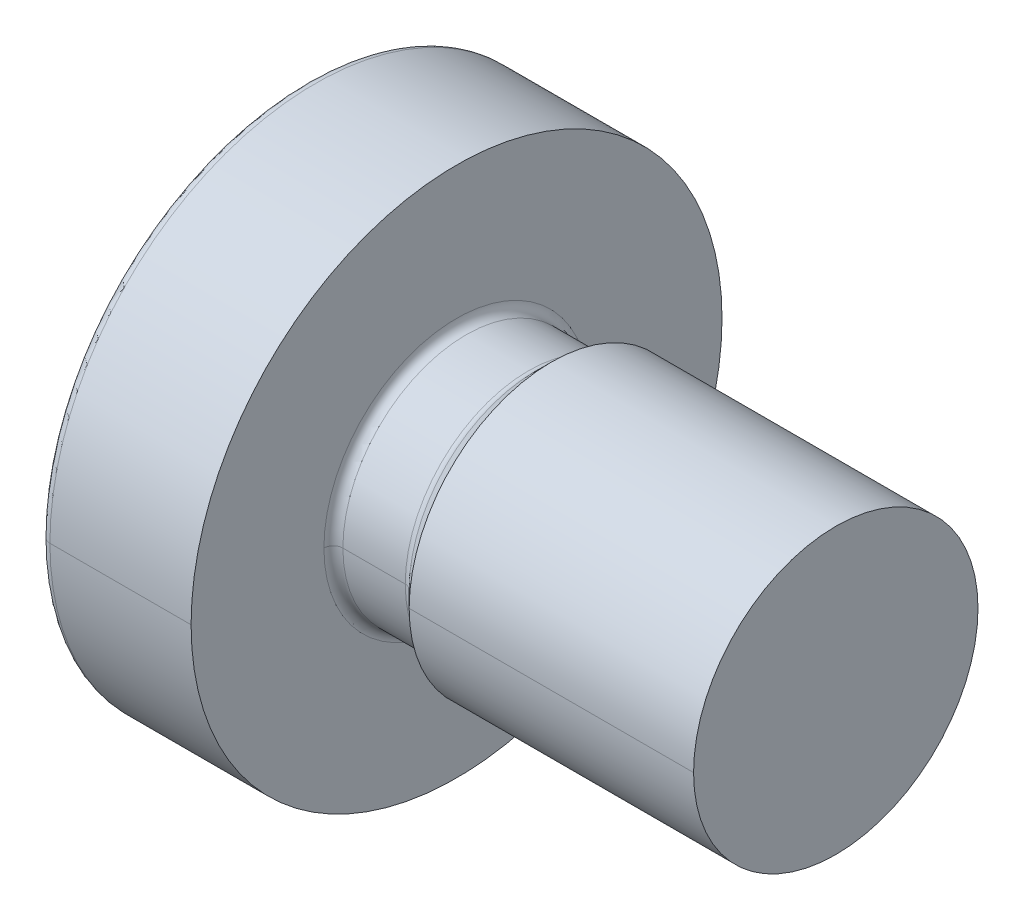
ISO-10303-21;
HEADER;
FILE_DESCRIPTION(('STEP AP214'),'2;1');
FILE_NAME('part.step','',(''),(''),'','','');
FILE_SCHEMA(('AUTOMOTIVE_DESIGN { 1 0 10303 214 1 1 1 1 }'));
ENDSEC;
DATA;
#1=APPLICATION_CONTEXT('core data for automotive mechanical design processes');
#2=APPLICATION_PROTOCOL_DEFINITION('international standard','automotive_design',2000,#1);
#3=PRODUCT_CONTEXT('',#1,'mechanical');
#4=PRODUCT('Part','Part','',(#3));
#5=PRODUCT_RELATED_PRODUCT_CATEGORY('part','',(#4));
#6=PRODUCT_DEFINITION_FORMATION('','',#4);
#7=PRODUCT_DEFINITION_CONTEXT('part definition',#1,'design');
#8=PRODUCT_DEFINITION('design','',#6,#7);
#9=PRODUCT_DEFINITION_SHAPE('','',#8);
#10=(LENGTH_UNIT() NAMED_UNIT(*) SI_UNIT(.MILLI.,.METRE.));
#11=(NAMED_UNIT(*) PLANE_ANGLE_UNIT() SI_UNIT($,.RADIAN.));
#12=(NAMED_UNIT(*) SI_UNIT($,.STERADIAN.) SOLID_ANGLE_UNIT());
#13=UNCERTAINTY_MEASURE_WITH_UNIT(LENGTH_MEASURE(1.E-05),#10,'distance_accuracy_value','');
#14=(GEOMETRIC_REPRESENTATION_CONTEXT(3) GLOBAL_UNCERTAINTY_ASSIGNED_CONTEXT((#13)) GLOBAL_UNIT_ASSIGNED_CONTEXT((#10,
#11,#12)) REPRESENTATION_CONTEXT('',''));
#15=CARTESIAN_POINT('',(0.,0.,0.));
#16=DIRECTION('',(0.,0.,1.));
#17=DIRECTION('',(1.,0.,0.));
#18=AXIS2_PLACEMENT_3D('',#15,#16,#17);
#19=CARTESIAN_POINT('',(2.5,0.,0.));
#20=DIRECTION('',(-1.,0.,0.));
#21=DIRECTION('',(0.,0.,1.));
#22=AXIS2_PLACEMENT_3D('',#19,#20,#21);
#23=TOROIDAL_SURFACE('',#22,1.399,0.1);
#24=CARTESIAN_POINT('',(2.4,0.,0.));
#25=DIRECTION('',(-1.,0.,0.));
#26=DIRECTION('',(0.,0.,1.));
#27=AXIS2_PLACEMENT_3D('',#24,#25,#26);
#28=CIRCLE('',#27,1.399);
#29=CARTESIAN_POINT('',(2.4,0.,-1.399));
#30=VERTEX_POINT('',#29);
#31=CARTESIAN_POINT('',(2.4,0.,1.399));
#32=VERTEX_POINT('',#31);
#33=EDGE_CURVE('E40',#30,#32,#28,.T.);
#34=ORIENTED_EDGE('',*,*,#33,.F.);
#35=CARTESIAN_POINT('',(2.5,0.,-1.399));
#36=DIRECTION('',(0.,1.,0.));
#37=DIRECTION('',(0.,0.,1.));
#38=AXIS2_PLACEMENT_3D('',#35,#36,#37);
#39=CIRCLE('',#38,0.1);
#40=CARTESIAN_POINT('',(2.5,0.,-1.299));
#41=VERTEX_POINT('',#40);
#42=EDGE_CURVE('E10',#30,#41,#39,.T.);
#43=ORIENTED_EDGE('',*,*,#42,.T.);
#44=CARTESIAN_POINT('',(2.5,0.,0.));
#45=DIRECTION('',(1.,0.,0.));
#46=DIRECTION('',(0.,0.,1.));
#47=AXIS2_PLACEMENT_3D('',#44,#45,#46);
#48=CIRCLE('',#47,1.299);
#49=CARTESIAN_POINT('',(2.5,0.,1.299));
#50=VERTEX_POINT('',#49);
#51=EDGE_CURVE('E291',#50,#41,#48,.T.);
#52=ORIENTED_EDGE('',*,*,#51,.F.);
#53=CARTESIAN_POINT('',(2.5,0.,1.399));
#54=DIRECTION('',(0.,-1.,0.));
#55=DIRECTION('',(0.,0.,-1.));
#56=AXIS2_PLACEMENT_3D('',#53,#54,#55);
#57=CIRCLE('',#56,0.1);
#58=EDGE_CURVE('E267',#32,#50,#57,.T.);
#59=ORIENTED_EDGE('',*,*,#58,.F.);
#60=EDGE_LOOP('',(#34,#43,#52,#59));
#61=FACE_BOUND('',#60,.T.);
#62=ADVANCED_FACE('F15',(#61),#23,.F.);
#63=CARTESIAN_POINT('',(3.15757864376269,0.,0.));
#64=DIRECTION('',(-1.,0.,0.));
#65=DIRECTION('',(0.,0.,1.));
#66=AXIS2_PLACEMENT_3D('',#63,#64,#65);
#67=TOROIDAL_SURFACE('',#66,1.399,0.1);
#68=CARTESIAN_POINT('',(3.15757864376269,0.,0.));
#69=DIRECTION('',(-1.,0.,0.));
#70=DIRECTION('',(0.,0.,1.));
#71=AXIS2_PLACEMENT_3D('',#68,#69,#70);
#72=CIRCLE('',#71,1.299);
#73=CARTESIAN_POINT('',(3.15757864376269,0.,-1.299));
#74=VERTEX_POINT('',#73);
#75=CARTESIAN_POINT('',(3.15757864376269,0.,1.299));
#76=VERTEX_POINT('',#75);
#77=EDGE_CURVE('E259',#74,#76,#72,.T.);
#78=ORIENTED_EDGE('',*,*,#77,.F.);
#79=CARTESIAN_POINT('',(3.15757864376269,0.,-1.399));
#80=DIRECTION('',(0.,1.,0.));
#81=DIRECTION('',(0.,0.,1.));
#82=AXIS2_PLACEMENT_3D('',#79,#80,#81);
#83=CIRCLE('',#82,0.1);
#84=CARTESIAN_POINT('',(3.22828932188134,0.,-1.32828932188134));
#85=VERTEX_POINT('',#84);
#86=EDGE_CURVE('E26',#74,#85,#83,.T.);
#87=ORIENTED_EDGE('',*,*,#86,.T.);
#88=CARTESIAN_POINT('',(3.22828932188134,0.,0.));
#89=DIRECTION('',(1.,0.,0.));
#90=DIRECTION('',(0.,0.,-1.));
#91=AXIS2_PLACEMENT_3D('',#88,#89,#90);
#92=CIRCLE('',#91,1.32828932188134);
#93=CARTESIAN_POINT('',(3.22828932188134,0.,1.32828932188134));
#94=VERTEX_POINT('',#93);
#95=EDGE_CURVE('E261',#94,#85,#92,.T.);
#96=ORIENTED_EDGE('',*,*,#95,.F.);
#97=CARTESIAN_POINT('',(3.15757864376269,0.,1.399));
#98=DIRECTION('',(0.,-1.,0.));
#99=DIRECTION('',(0.,0.,-1.));
#100=AXIS2_PLACEMENT_3D('',#97,#98,#99);
#101=CIRCLE('',#100,0.1);
#102=EDGE_CURVE('E255',#76,#94,#101,.T.);
#103=ORIENTED_EDGE('',*,*,#102,.F.);
#104=EDGE_LOOP('',(#78,#87,#96,#103));
#105=FACE_BOUND('',#104,.T.);
#106=ADVANCED_FACE('F257',(#105),#67,.F.);
#107=CARTESIAN_POINT('',(0.910990339947826,0.,0.));
#108=DIRECTION('',(1.,0.,0.));
#109=DIRECTION('',(0.,0.,-1.));
#110=AXIS2_PLACEMENT_3D('',#107,#108,#109);
#111=TOROIDAL_SURFACE('',#110,2.7,0.1);
#112=CARTESIAN_POINT('',(0.827541163212067,0.,0.));
#113=DIRECTION('',(-1.,0.,0.));
#114=DIRECTION('',(0.,0.,-1.));
#115=AXIS2_PLACEMENT_3D('',#112,#113,#114);
#116=CIRCLE('',#115,2.75510204081632);
#117=CARTESIAN_POINT('',(0.827541163212067,0.,2.75510204081632));
#118=VERTEX_POINT('',#117);
#119=CARTESIAN_POINT('',(0.827541163212066,2.75510204081632,0.));
#120=VERTEX_POINT('',#119);
#121=EDGE_CURVE('E203',#118,#120,#116,.T.);
#122=ORIENTED_EDGE('',*,*,#121,.F.);
#123=CARTESIAN_POINT('',(0.910990339947826,0.,2.7));
#124=DIRECTION('',(0.,1.,0.));
#125=DIRECTION('',(0.,0.,1.));
#126=AXIS2_PLACEMENT_3D('',#123,#124,#125);
#127=CIRCLE('',#126,0.1);
#128=CARTESIAN_POINT('',(0.910990339947826,0.,2.8));
#129=VERTEX_POINT('',#128);
#130=EDGE_CURVE('E363',#118,#129,#127,.T.);
#131=ORIENTED_EDGE('',*,*,#130,.T.);
#132=CARTESIAN_POINT('',(0.910990339947826,0.,0.));
#133=DIRECTION('',(1.,0.,0.));
#134=DIRECTION('',(0.,0.,-1.));
#135=AXIS2_PLACEMENT_3D('',#132,#133,#134);
#136=CIRCLE('',#135,2.8);
#137=CARTESIAN_POINT('',(0.910990339947826,0.,-2.8));
#138=VERTEX_POINT('',#137);
#139=EDGE_CURVE('E376',#138,#129,#136,.T.);
#140=ORIENTED_EDGE('',*,*,#139,.F.);
#141=CARTESIAN_POINT('',(0.910990339947826,0.,-2.7));
#142=DIRECTION('',(0.,-1.,0.));
#143=DIRECTION('',(0.,0.,-1.));
#144=AXIS2_PLACEMENT_3D('',#141,#142,#143);
#145=CIRCLE('',#144,0.1);
#146=CARTESIAN_POINT('',(0.827541163212067,0.,-2.75510204081632));
#147=VERTEX_POINT('',#146);
#148=EDGE_CURVE('E214',#147,#138,#145,.T.);
#149=ORIENTED_EDGE('',*,*,#148,.F.);
#150=CARTESIAN_POINT('',(0.827541163212067,0.,0.));
#151=DIRECTION('',(-1.,0.,0.));
#152=DIRECTION('',(0.,0.,-1.));
#153=AXIS2_PLACEMENT_3D('',#150,#151,#152);
#154=CIRCLE('',#153,2.75510204081632);
#155=EDGE_CURVE('E498',#120,#147,#154,.T.);
#156=ORIENTED_EDGE('',*,*,#155,.F.);
#157=EDGE_LOOP('',(#122,#131,#140,#149,#156));
#158=FACE_BOUND('',#157,.T.);
#159=ADVANCED_FACE('F656',(#158),#111,.T.);
#160=CARTESIAN_POINT('',(-3.4420013783492,0.,0.));
#161=DIRECTION('',(-1.,0.,0.));
#162=DIRECTION('',(0.,0.,1.));
#163=AXIS2_PLACEMENT_3D('',#160,#161,#162);
#164=CYLINDRICAL_SURFACE('',#163,1.5);
#165=CARTESIAN_POINT('',(6.4,0.,0.));
#166=DIRECTION('',(-1.,0.,0.));
#167=DIRECTION('',(0.,0.,1.));
#168=AXIS2_PLACEMENT_3D('',#165,#166,#167);
#169=CIRCLE('',#168,1.5);
#170=CARTESIAN_POINT('',(6.4,0.,1.5));
#171=VERTEX_POINT('',#170);
#172=CARTESIAN_POINT('',(6.4,0.,-1.5));
#173=VERTEX_POINT('',#172);
#174=EDGE_CURVE('E370',#171,#173,#169,.T.);
#175=ORIENTED_EDGE('',*,*,#174,.T.);
#176=DIRECTION('',(-1.,0.,0.));
#177=VECTOR('',#176,1.);
#178=CARTESIAN_POINT('',(-3.4420013783492,0.,-1.5));
#179=LINE('',#178,#177);
#180=CARTESIAN_POINT('',(3.4,0.,-1.5));
#181=VERTEX_POINT('',#180);
#182=EDGE_CURVE('E407',#173,#181,#179,.T.);
#183=ORIENTED_EDGE('',*,*,#182,.T.);
#184=CARTESIAN_POINT('',(3.4,0.,0.));
#185=DIRECTION('',(-1.,0.,0.));
#186=DIRECTION('',(0.,0.,1.));
#187=AXIS2_PLACEMENT_3D('',#184,#185,#186);
#188=CIRCLE('',#187,1.5);
#189=CARTESIAN_POINT('',(3.4,0.,1.5));
#190=VERTEX_POINT('',#189);
#191=EDGE_CURVE('E284',#190,#181,#188,.T.);
#192=ORIENTED_EDGE('',*,*,#191,.F.);
#193=DIRECTION('',(-1.,0.,0.));
#194=VECTOR('',#193,1.);
#195=CARTESIAN_POINT('',(-3.4420013783492,0.,1.5));
#196=LINE('',#195,#194);
#197=EDGE_CURVE('E419',#171,#190,#196,.T.);
#198=ORIENTED_EDGE('',*,*,#197,.F.);
#199=EDGE_LOOP('',(#175,#183,#192,#198));
#200=FACE_BOUND('',#199,.T.);
#201=ADVANCED_FACE('F631',(#200),#164,.T.);
#202=CARTESIAN_POINT('',(3.4,0.,0.));
#203=DIRECTION('',(1.,0.,0.));
#204=DIRECTION('',(0.,0.,-1.));
#205=AXIS2_PLACEMENT_3D('',#202,#203,#204);
#206=CONICAL_SURFACE('',#205,1.5,0.78539816339744);
#207=CARTESIAN_POINT('',(3.22828932188134,0.,0.));
#208=DIRECTION('',(1.,0.,0.));
#209=DIRECTION('',(0.,0.,-1.));
#210=AXIS2_PLACEMENT_3D('',#207,#208,#209);
#211=CIRCLE('',#210,1.32828932188134);
#212=EDGE_CURVE('E334',#85,#94,#211,.T.);
#213=ORIENTED_EDGE('',*,*,#212,.T.);
#214=DIRECTION('',(0.707106781186554,0.,0.707106781186541));
#215=VECTOR('',#214,1.);
#216=CARTESIAN_POINT('',(3.4,0.,1.5));
#217=LINE('',#216,#215);
#218=EDGE_CURVE('E330',#94,#190,#217,.T.);
#219=ORIENTED_EDGE('',*,*,#218,.T.);
#220=ORIENTED_EDGE('',*,*,#191,.T.);
#221=DIRECTION('',(0.707106781186554,0.,-0.707106781186541));
#222=VECTOR('',#221,1.);
#223=CARTESIAN_POINT('',(3.4,0.,-1.5));
#224=LINE('',#223,#222);
#225=EDGE_CURVE('E321',#85,#181,#224,.T.);
#226=ORIENTED_EDGE('',*,*,#225,.F.);
#227=EDGE_LOOP('',(#213,#219,#220,#226));
#228=FACE_BOUND('',#227,.T.);
#229=ADVANCED_FACE('F627',(#228),#206,.T.);
#230=CARTESIAN_POINT('',(-3.4420013783492,0.,0.));
#231=DIRECTION('',(-1.,0.,0.));
#232=DIRECTION('',(0.,0.,1.));
#233=AXIS2_PLACEMENT_3D('',#230,#231,#232);
#234=CYLINDRICAL_SURFACE('',#233,1.299);
#235=CARTESIAN_POINT('',(3.15757864376269,0.,0.));
#236=DIRECTION('',(-1.,0.,0.));
#237=DIRECTION('',(0.,0.,1.));
#238=AXIS2_PLACEMENT_3D('',#235,#236,#237);
#239=CIRCLE('',#238,1.299);
#240=EDGE_CURVE('E280',#76,#74,#239,.T.);
#241=ORIENTED_EDGE('',*,*,#240,.T.);
#242=DIRECTION('',(-1.,0.,0.));
#243=VECTOR('',#242,1.);
#244=CARTESIAN_POINT('',(-3.4420013783492,0.,-1.299));
#245=LINE('',#244,#243);
#246=EDGE_CURVE('E276',#74,#41,#245,.T.);
#247=ORIENTED_EDGE('',*,*,#246,.T.);
#248=CARTESIAN_POINT('',(2.5,0.,0.));
#249=DIRECTION('',(1.,0.,0.));
#250=DIRECTION('',(0.,0.,1.));
#251=AXIS2_PLACEMENT_3D('',#248,#249,#250);
#252=CIRCLE('',#251,1.299);
#253=EDGE_CURVE('E289',#41,#50,#252,.T.);
#254=ORIENTED_EDGE('',*,*,#253,.T.);
#255=DIRECTION('',(-1.,0.,0.));
#256=VECTOR('',#255,1.);
#257=CARTESIAN_POINT('',(-3.4420013783492,0.,1.299));
#258=LINE('',#257,#256);
#259=EDGE_CURVE('E274',#76,#50,#258,.T.);
#260=ORIENTED_EDGE('',*,*,#259,.F.);
#261=EDGE_LOOP('',(#241,#247,#254,#260));
#262=FACE_BOUND('',#261,.T.);
#263=ADVANCED_FACE('F287',(#262),#234,.T.);
#264=CARTESIAN_POINT('',(-3.4420013783492,0.,0.));
#265=DIRECTION('',(-1.,0.,0.));
#266=DIRECTION('',(0.,0.,1.));
#267=AXIS2_PLACEMENT_3D('',#264,#265,#266);
#268=CYLINDRICAL_SURFACE('',#267,2.8);
#269=CARTESIAN_POINT('',(2.4,0.,0.));
#270=DIRECTION('',(-1.,0.,0.));
#271=DIRECTION('',(0.,0.,1.));
#272=AXIS2_PLACEMENT_3D('',#269,#270,#271);
#273=CIRCLE('',#272,2.8);
#274=CARTESIAN_POINT('',(2.4,0.,2.8));
#275=VERTEX_POINT('',#274);
#276=CARTESIAN_POINT('',(2.4,0.,-2.8));
#277=VERTEX_POINT('',#276);
#278=EDGE_CURVE('E375',#275,#277,#273,.T.);
#279=ORIENTED_EDGE('',*,*,#278,.T.);
#280=DIRECTION('',(-1.,0.,0.));
#281=VECTOR('',#280,1.);
#282=CARTESIAN_POINT('',(-3.4420013783492,0.,-2.8));
#283=LINE('',#282,#281);
#284=EDGE_CURVE('E371',#277,#138,#283,.T.);
#285=ORIENTED_EDGE('',*,*,#284,.T.);
#286=ORIENTED_EDGE('',*,*,#139,.T.);
#287=DIRECTION('',(-1.,0.,0.));
#288=VECTOR('',#287,1.);
#289=CARTESIAN_POINT('',(-3.4420013783492,0.,2.8));
#290=LINE('',#289,#288);
#291=EDGE_CURVE('E390',#275,#129,#290,.T.);
#292=ORIENTED_EDGE('',*,*,#291,.F.);
#293=EDGE_LOOP('',(#279,#285,#286,#292));
#294=FACE_BOUND('',#293,.T.);
#295=ADVANCED_FACE('F674',(#294),#268,.T.);
#296=CARTESIAN_POINT('',(5.,0.,0.));
#297=DIRECTION('',(0.,0.,-1.));
#298=DIRECTION('',(0.,1.,0.));
#299=AXIS2_PLACEMENT_3D('',#296,#297,#298);
#300=SPHERICAL_SURFACE('',#299,5.);
#301=ORIENTED_EDGE('',*,*,#155,.T.);
#302=CARTESIAN_POINT('',(0.827541163212067,0.,0.));
#303=DIRECTION('',(-1.,0.,0.));
#304=DIRECTION('',(0.,0.,-1.));
#305=AXIS2_PLACEMENT_3D('',#302,#303,#304);
#306=CIRCLE('',#305,2.75510204081632);
#307=CARTESIAN_POINT('',(0.827541163212066,-2.75510204081632,0.));
#308=VERTEX_POINT('',#307);
#309=EDGE_CURVE('E315',#147,#308,#306,.T.);
#310=ORIENTED_EDGE('',*,*,#309,.T.);
#311=CARTESIAN_POINT('',(5.,0.,0.));
#312=DIRECTION('',(0.,0.,-1.));
#313=DIRECTION('',(0.,1.,0.));
#314=AXIS2_PLACEMENT_3D('',#311,#312,#313);
#315=CIRCLE('',#314,5.);
#316=CARTESIAN_POINT('',(0.0483882559325496,-0.693931650822548,0.));
#317=VERTEX_POINT('',#316);
#318=EDGE_CURVE('E311',#308,#317,#315,.T.);
#319=ORIENTED_EDGE('',*,*,#318,.T.);
#320=CARTESIAN_POINT('',(5.00907871968526,-0.073940238239228,0.0283829982019893));
#321=DIRECTION('',(0.113883497498907,-0.927506656060475,0.356036447517571));
#322=DIRECTION('',(0.,-0.358367949545293,-0.933580426497205));
#323=AXIS2_PLACEMENT_3D('',#320,#321,#322);
#324=CIRCLE('',#323,4.9993644419497);
#325=CARTESIAN_POINT('',(0.0743133377131422,-0.805315831954644,-0.298458231192017));
#326=VERTEX_POINT('',#325);
#327=EDGE_CURVE('E316',#317,#326,#324,.T.);
#328=ORIENTED_EDGE('',*,*,#327,.T.);
#329=CARTESIAN_POINT('',(4.99447111284247,0.0450291723721179,-0.0434841662986069));
#330=DIRECTION('',(0.0879813128153511,-0.716550290756221,0.691964572368025));
#331=DIRECTION('',(0.,-0.694658370458996,-0.719339800338653));
#332=AXIS2_PLACEMENT_3D('',#329,#330,#331);
#333=CIRCLE('',#332,4.99960507763599);
#334=CARTESIAN_POINT('',(0.212229293358308,-1.22830113216143,-0.754007950458526));
#335=VERTEX_POINT('',#334);
#336=EDGE_CURVE('E441',#326,#335,#333,.T.);
#337=ORIENTED_EDGE('',*,*,#336,.T.);
#338=CARTESIAN_POINT('',(4.60651618361134,0.558053223935769,0.55805322393577));
#339=DIRECTION('',(-0.446197814505031,0.632814155313759,0.63281415531376));
#340=DIRECTION('',(0.,-0.707106781186548,0.707106781186547));
#341=AXIS2_PLACEMENT_3D('',#338,#339,#340);
#342=CIRCLE('',#341,4.92161799459791);
#343=CARTESIAN_POINT('',(0.212229294438488,-0.754007950138534,-1.22830113171978));
#344=VERTEX_POINT('',#343);
#345=EDGE_CURVE('E348',#344,#335,#342,.T.);
#346=ORIENTED_EDGE('',*,*,#345,.F.);
#347=CARTESIAN_POINT('',(4.99447111284247,-0.0434841662986056,0.0450291723721165));
#348=DIRECTION('',(0.0879813128153507,0.691964572368025,-0.716550290756221));
#349=DIRECTION('',(0.,0.719339800338653,0.694658370458996));
#350=AXIS2_PLACEMENT_3D('',#347,#348,#349);
#351=CIRCLE('',#350,4.99960507763599);
#352=CARTESIAN_POINT('',(0.0743133377131075,-0.298458231192018,-0.805315831954648));
#353=VERTEX_POINT('',#352);
#354=EDGE_CURVE('E445',#344,#353,#351,.T.);
#355=ORIENTED_EDGE('',*,*,#354,.T.);
#356=CARTESIAN_POINT('',(5.00907871968526,0.0283829982019898,-0.0739402382392289));
#357=DIRECTION('',(0.113883497498906,0.356036447517571,-0.927506656060475));
#358=DIRECTION('',(0.,0.933580426497205,0.358367949545293));
#359=AXIS2_PLACEMENT_3D('',#356,#357,#358);
#360=CIRCLE('',#359,4.9993644419497);
#361=CARTESIAN_POINT('',(0.04838825593255,0.,-0.693931650822548));
#362=VERTEX_POINT('',#361);
#363=EDGE_CURVE('E456',#353,#362,#360,.T.);
#364=ORIENTED_EDGE('',*,*,#363,.T.);
#365=CARTESIAN_POINT('',(5.00907871968526,-0.0283829982019896,-0.0739402382392284));
#366=DIRECTION('',(0.113883497498906,-0.356036447517572,-0.927506656060475));
#367=DIRECTION('',(0.,0.933580426497204,-0.358367949545294));
#368=AXIS2_PLACEMENT_3D('',#365,#366,#367);
#369=CIRCLE('',#368,4.9993644419497);
#370=CARTESIAN_POINT('',(0.0743133377131416,0.298458231192017,-0.805315831954644));
#371=VERTEX_POINT('',#370);
#372=EDGE_CURVE('E471',#362,#371,#369,.T.);
#373=ORIENTED_EDGE('',*,*,#372,.T.);
#374=CARTESIAN_POINT('',(4.99447111284247,0.043484166298606,0.0450291723721169));
#375=DIRECTION('',(0.0879813128153509,-0.691964572368024,-0.716550290756221));
#376=DIRECTION('',(0.,0.719339800338653,-0.694658370458996));
#377=AXIS2_PLACEMENT_3D('',#374,#375,#376);
#378=CIRCLE('',#377,4.99960507763599);
#379=CARTESIAN_POINT('',(0.212229293358308,0.754007950458526,-1.22830113216143));
#380=VERTEX_POINT('',#379);
#381=EDGE_CURVE('E19',#371,#380,#378,.T.);
#382=ORIENTED_EDGE('',*,*,#381,.T.);
#383=CARTESIAN_POINT('',(4.60651618361134,-0.558053223935769,0.558053223935769));
#384=DIRECTION('',(-0.446197814505031,-0.63281415531376,0.63281415531376));
#385=DIRECTION('',(0.,-0.707106781186548,-0.707106781186547));
#386=AXIS2_PLACEMENT_3D('',#383,#384,#385);
#387=CIRCLE('',#386,4.92161799459791);
#388=CARTESIAN_POINT('',(0.212229293358308,1.22830113216143,-0.754007950458526));
#389=VERTEX_POINT('',#388);
#390=EDGE_CURVE('E461',#389,#380,#387,.T.);
#391=ORIENTED_EDGE('',*,*,#390,.F.);
#392=CARTESIAN_POINT('',(4.99447111284247,-0.0450291723721175,-0.0434841662986066));
#393=DIRECTION('',(0.087981312815351,0.716550290756221,0.691964572368025));
#394=DIRECTION('',(0.,-0.694658370458996,0.719339800338653));
#395=AXIS2_PLACEMENT_3D('',#392,#393,#394);
#396=CIRCLE('',#395,4.99960507763599);
#397=CARTESIAN_POINT('',(0.0743133377131069,0.805315831954649,-0.298458231192017));
#398=VERTEX_POINT('',#397);
#399=EDGE_CURVE('E565',#389,#398,#396,.T.);
#400=ORIENTED_EDGE('',*,*,#399,.T.);
#401=CARTESIAN_POINT('',(5.00907871968526,0.0739402382392284,0.0283829982019895));
#402=DIRECTION('',(0.113883497498906,0.927506656060475,0.356036447517571));
#403=DIRECTION('',(0.,-0.358367949545293,0.933580426497205));
#404=AXIS2_PLACEMENT_3D('',#401,#402,#403);
#405=CIRCLE('',#404,4.9993644419497);
#406=CARTESIAN_POINT('',(0.0483882559325506,0.693931650822548,0.));
#407=VERTEX_POINT('',#406);
#408=EDGE_CURVE('E405',#398,#407,#405,.T.);
#409=ORIENTED_EDGE('',*,*,#408,.T.);
#410=CARTESIAN_POINT('',(5.,0.,0.));
#411=DIRECTION('',(0.,0.,1.));
#412=DIRECTION('',(1.,0.,0.));
#413=AXIS2_PLACEMENT_3D('',#410,#411,#412);
#414=CIRCLE('',#413,5.);
#415=EDGE_CURVE('E427',#120,#407,#414,.T.);
#416=ORIENTED_EDGE('',*,*,#415,.F.);
#417=EDGE_LOOP('',(#301,#310,#319,#328,#337,#346,#355,#364,#373,#382,#391,#400,#409,#416));
#418=FACE_BOUND('',#417,.T.);
#419=ADVANCED_FACE('F677',(#418),#300,.T.);
#420=CARTESIAN_POINT('',(5.,0.,0.));
#421=DIRECTION('',(0.,0.,-1.));
#422=DIRECTION('',(0.,1.,0.));
#423=AXIS2_PLACEMENT_3D('',#420,#421,#422);
#424=SPHERICAL_SURFACE('',#423,5.);
#425=ORIENTED_EDGE('',*,*,#318,.F.);
#426=CARTESIAN_POINT('',(0.827541163212067,0.,0.));
#427=DIRECTION('',(-1.,0.,0.));
#428=DIRECTION('',(0.,0.,-1.));
#429=AXIS2_PLACEMENT_3D('',#426,#427,#428);
#430=CIRCLE('',#429,2.75510204081632);
#431=EDGE_CURVE('E403',#308,#118,#430,.T.);
#432=ORIENTED_EDGE('',*,*,#431,.T.);
#433=ORIENTED_EDGE('',*,*,#121,.T.);
#434=ORIENTED_EDGE('',*,*,#415,.T.);
#435=CARTESIAN_POINT('',(5.00907871968526,0.0739402382392284,-0.0283829982019895));
#436=DIRECTION('',(0.113883497498906,0.927506656060475,-0.356036447517571));
#437=DIRECTION('',(0.,0.358367949545293,0.933580426497205));
#438=AXIS2_PLACEMENT_3D('',#435,#436,#437);
#439=CIRCLE('',#438,4.9993644419497);
#440=CARTESIAN_POINT('',(0.0743133377131422,0.805315831954644,0.298458231192017));
#441=VERTEX_POINT('',#440);
#442=EDGE_CURVE('E531',#407,#441,#439,.T.);
#443=ORIENTED_EDGE('',*,*,#442,.T.);
#444=CARTESIAN_POINT('',(4.99447111284247,-0.0450291723721173,0.0434841662986063));
#445=DIRECTION('',(0.0879813128153509,0.716550290756221,-0.691964572368025));
#446=DIRECTION('',(0.,0.694658370458996,0.719339800338653));
#447=AXIS2_PLACEMENT_3D('',#444,#445,#446);
#448=CIRCLE('',#447,4.99960507763599);
#449=CARTESIAN_POINT('',(0.212229293358308,1.22830113216143,0.754007950458526));
#450=VERTEX_POINT('',#449);
#451=EDGE_CURVE('E553',#441,#450,#448,.T.);
#452=ORIENTED_EDGE('',*,*,#451,.T.);
#453=CARTESIAN_POINT('',(4.60651618361134,-0.558053223935769,-0.55805322393577));
#454=DIRECTION('',(-0.446197814505031,-0.63281415531376,-0.63281415531376));
#455=DIRECTION('',(0.,0.707106781186548,-0.707106781186547));
#456=AXIS2_PLACEMENT_3D('',#453,#454,#455);
#457=CIRCLE('',#456,4.92161799459792);
#458=CARTESIAN_POINT('',(0.212229294438488,0.754007950138533,1.22830113171978));
#459=VERTEX_POINT('',#458);
#460=EDGE_CURVE('E231',#459,#450,#457,.T.);
#461=ORIENTED_EDGE('',*,*,#460,.F.);
#462=CARTESIAN_POINT('',(4.99447111284247,0.043484166298606,-0.0450291723721169));
#463=DIRECTION('',(0.0879813128153509,-0.691964572368024,0.716550290756221));
#464=DIRECTION('',(0.,-0.719339800338653,-0.694658370458996));
#465=AXIS2_PLACEMENT_3D('',#462,#463,#464);
#466=CIRCLE('',#465,4.99960507763599);
#467=CARTESIAN_POINT('',(0.0743133377131075,0.298458231192017,0.805315831954648));
#468=VERTEX_POINT('',#467);
#469=EDGE_CURVE('E596',#459,#468,#466,.T.);
#470=ORIENTED_EDGE('',*,*,#469,.T.);
#471=CARTESIAN_POINT('',(5.00907871968526,-0.0283829982019896,0.0739402382392284));
#472=DIRECTION('',(0.113883497498906,-0.356036447517572,0.927506656060475));
#473=DIRECTION('',(0.,-0.933580426497204,-0.358367949545294));
#474=AXIS2_PLACEMENT_3D('',#471,#472,#473);
#475=CIRCLE('',#474,4.9993644419497);
#476=CARTESIAN_POINT('',(0.0483882559325501,0.,0.693931650822548));
#477=VERTEX_POINT('',#476);
#478=EDGE_CURVE('E550',#468,#477,#475,.T.);
#479=ORIENTED_EDGE('',*,*,#478,.T.);
#480=CARTESIAN_POINT('',(5.00907871968526,0.0283829982019898,0.0739402382392289));
#481=DIRECTION('',(0.113883497498906,0.356036447517571,0.927506656060475));
#482=DIRECTION('',(0.,-0.933580426497205,0.358367949545293));
#483=AXIS2_PLACEMENT_3D('',#480,#481,#482);
#484=CIRCLE('',#483,4.9993644419497);
#485=CARTESIAN_POINT('',(0.0743133377131421,-0.298458231192018,0.805315831954644));
#486=VERTEX_POINT('',#485);
#487=EDGE_CURVE('E359',#477,#486,#484,.T.);
#488=ORIENTED_EDGE('',*,*,#487,.T.);
#489=CARTESIAN_POINT('',(4.99447111284247,-0.0434841662986054,-0.0450291723721164));
#490=DIRECTION('',(0.0879813128153507,0.691964572368024,0.716550290756221));
#491=DIRECTION('',(0.,-0.719339800338653,0.694658370458996));
#492=AXIS2_PLACEMENT_3D('',#489,#490,#491);
#493=CIRCLE('',#492,4.99960507763599);
#494=CARTESIAN_POINT('',(0.212229293358308,-0.754007950458526,1.22830113216143));
#495=VERTEX_POINT('',#494);
#496=EDGE_CURVE('E355',#486,#495,#493,.T.);
#497=ORIENTED_EDGE('',*,*,#496,.T.);
#498=CARTESIAN_POINT('',(4.60651618361134,0.558053223935768,-0.558053223935769));
#499=DIRECTION('',(-0.446197814505031,0.632814155313759,-0.63281415531376));
#500=DIRECTION('',(0.,0.707106781186548,0.707106781186547));
#501=AXIS2_PLACEMENT_3D('',#498,#499,#500);
#502=CIRCLE('',#501,4.92161799459792);
#503=CARTESIAN_POINT('',(0.212229294438489,-1.22830113171978,0.754007950138533));
#504=VERTEX_POINT('',#503);
#505=EDGE_CURVE('E301',#504,#495,#502,.T.);
#506=ORIENTED_EDGE('',*,*,#505,.F.);
#507=CARTESIAN_POINT('',(4.99447111284247,0.0450291723721179,0.0434841662986069));
#508=DIRECTION('',(0.0879813128153511,-0.716550290756221,-0.691964572368025));
#509=DIRECTION('',(0.,0.694658370458996,-0.719339800338653));
#510=AXIS2_PLACEMENT_3D('',#507,#508,#509);
#511=CIRCLE('',#510,4.99960507763599);
#512=CARTESIAN_POINT('',(0.0743133377131069,-0.805315831954648,0.298458231192017));
#513=VERTEX_POINT('',#512);
#514=EDGE_CURVE('E360',#504,#513,#511,.T.);
#515=ORIENTED_EDGE('',*,*,#514,.T.);
#516=CARTESIAN_POINT('',(5.00907871968526,-0.0739402382392281,-0.0283829982019894));
#517=DIRECTION('',(0.113883497498907,-0.927506656060475,-0.356036447517571));
#518=DIRECTION('',(0.,0.358367949545293,-0.933580426497205));
#519=AXIS2_PLACEMENT_3D('',#516,#517,#518);
#520=CIRCLE('',#519,4.9993644419497);
#521=EDGE_CURVE('E428',#513,#317,#520,.T.);
#522=ORIENTED_EDGE('',*,*,#521,.T.);
#523=EDGE_LOOP('',(#425,#432,#433,#434,#443,#452,#461,#470,#479,#488,#497,#506,#515,#522));
#524=FACE_BOUND('',#523,.T.);
#525=ADVANCED_FACE('F717',(#524),#424,.T.);
#526=CARTESIAN_POINT('',(-3.4420013783492,0.,0.));
#527=DIRECTION('',(-1.,0.,0.));
#528=DIRECTION('',(0.,0.,1.));
#529=AXIS2_PLACEMENT_3D('',#526,#527,#528);
#530=CYLINDRICAL_SURFACE('',#529,2.8);
#531=ORIENTED_EDGE('',*,*,#284,.F.);
#532=CARTESIAN_POINT('',(2.4,0.,0.));
#533=DIRECTION('',(-1.,0.,0.));
#534=DIRECTION('',(0.,0.,1.));
#535=AXIS2_PLACEMENT_3D('',#532,#533,#534);
#536=CIRCLE('',#535,2.8);
#537=EDGE_CURVE('E393',#277,#275,#536,.T.);
#538=ORIENTED_EDGE('',*,*,#537,.T.);
#539=ORIENTED_EDGE('',*,*,#291,.T.);
#540=CARTESIAN_POINT('',(0.910990339947826,0.,0.));
#541=DIRECTION('',(1.,0.,0.));
#542=DIRECTION('',(0.,0.,-1.));
#543=AXIS2_PLACEMENT_3D('',#540,#541,#542);
#544=CIRCLE('',#543,2.8);
#545=EDGE_CURVE('E394',#129,#138,#544,.T.);
#546=ORIENTED_EDGE('',*,*,#545,.T.);
#547=EDGE_LOOP('',(#531,#538,#539,#546));
#548=FACE_BOUND('',#547,.T.);
#549=ADVANCED_FACE('F1225',(#548),#530,.T.);
#550=CARTESIAN_POINT('',(2.4,2.8,0.));
#551=DIRECTION('',(-1.,0.,0.));
#552=DIRECTION('',(0.,0.,1.));
#553=AXIS2_PLACEMENT_3D('',#550,#551,#552);
#554=PLANE('',#553);
#555=ORIENTED_EDGE('',*,*,#278,.F.);
#556=ORIENTED_EDGE('',*,*,#537,.F.);
#557=EDGE_LOOP('',(#555,#556));
#558=FACE_BOUND('',#557,.T.);
#559=CARTESIAN_POINT('',(2.4,0.,0.));
#560=DIRECTION('',(-1.,0.,0.));
#561=DIRECTION('',(0.,0.,1.));
#562=AXIS2_PLACEMENT_3D('',#559,#560,#561);
#563=CIRCLE('',#562,1.399);
#564=EDGE_CURVE('E424',#32,#30,#563,.T.);
#565=ORIENTED_EDGE('',*,*,#564,.T.);
#566=ORIENTED_EDGE('',*,*,#33,.T.);
#567=EDGE_LOOP('',(#565,#566));
#568=FACE_BOUND('',#567,.T.);
#569=ADVANCED_FACE('F647',(#558,#568),#554,.F.);
#570=CARTESIAN_POINT('',(-3.4420013783492,0.,0.));
#571=DIRECTION('',(-1.,0.,0.));
#572=DIRECTION('',(0.,0.,1.));
#573=AXIS2_PLACEMENT_3D('',#570,#571,#572);
#574=CYLINDRICAL_SURFACE('',#573,1.299);
#575=ORIENTED_EDGE('',*,*,#246,.F.);
#576=ORIENTED_EDGE('',*,*,#77,.T.);
#577=ORIENTED_EDGE('',*,*,#259,.T.);
#578=ORIENTED_EDGE('',*,*,#51,.T.);
#579=EDGE_LOOP('',(#575,#576,#577,#578));
#580=FACE_BOUND('',#579,.T.);
#581=ADVANCED_FACE('F272',(#580),#574,.T.);
#582=CARTESIAN_POINT('',(3.4,0.,0.));
#583=DIRECTION('',(1.,0.,0.));
#584=DIRECTION('',(0.,0.,-1.));
#585=AXIS2_PLACEMENT_3D('',#582,#583,#584);
#586=CONICAL_SURFACE('',#585,1.5,0.78539816339744);
#587=ORIENTED_EDGE('',*,*,#218,.F.);
#588=ORIENTED_EDGE('',*,*,#95,.T.);
#589=ORIENTED_EDGE('',*,*,#225,.T.);
#590=CARTESIAN_POINT('',(3.4,0.,0.));
#591=DIRECTION('',(-1.,0.,0.));
#592=DIRECTION('',(0.,0.,1.));
#593=AXIS2_PLACEMENT_3D('',#590,#591,#592);
#594=CIRCLE('',#593,1.5);
#595=EDGE_CURVE('E317',#181,#190,#594,.T.);
#596=ORIENTED_EDGE('',*,*,#595,.T.);
#597=EDGE_LOOP('',(#587,#588,#589,#596));
#598=FACE_BOUND('',#597,.T.);
#599=ADVANCED_FACE('F637',(#598),#586,.T.);
#600=CARTESIAN_POINT('',(-3.4420013783492,0.,0.));
#601=DIRECTION('',(-1.,0.,0.));
#602=DIRECTION('',(0.,0.,1.));
#603=AXIS2_PLACEMENT_3D('',#600,#601,#602);
#604=CYLINDRICAL_SURFACE('',#603,1.5);
#605=ORIENTED_EDGE('',*,*,#182,.F.);
#606=CARTESIAN_POINT('',(6.4,0.,0.));
#607=DIRECTION('',(-1.,0.,0.));
#608=DIRECTION('',(0.,0.,1.));
#609=AXIS2_PLACEMENT_3D('',#606,#607,#608);
#610=CIRCLE('',#609,1.5);
#611=EDGE_CURVE('E322',#173,#171,#610,.T.);
#612=ORIENTED_EDGE('',*,*,#611,.T.);
#613=ORIENTED_EDGE('',*,*,#197,.T.);
#614=ORIENTED_EDGE('',*,*,#595,.F.);
#615=EDGE_LOOP('',(#605,#612,#613,#614));
#616=FACE_BOUND('',#615,.T.);
#617=ADVANCED_FACE('F635',(#616),#604,.T.);
#618=CARTESIAN_POINT('',(6.4,0.,0.));
#619=DIRECTION('',(-1.,0.,0.));
#620=DIRECTION('',(0.,0.,1.));
#621=AXIS2_PLACEMENT_3D('',#618,#619,#620);
#622=PLANE('',#621);
#623=ORIENTED_EDGE('',*,*,#174,.F.);
#624=ORIENTED_EDGE('',*,*,#611,.F.);
#625=EDGE_LOOP('',(#623,#624));
#626=FACE_BOUND('',#625,.T.);
#627=ADVANCED_FACE('F645',(#626),#622,.F.);
#628=CARTESIAN_POINT('',(0.910990339947826,0.,0.));
#629=DIRECTION('',(1.,0.,0.));
#630=DIRECTION('',(0.,0.,-1.));
#631=AXIS2_PLACEMENT_3D('',#628,#629,#630);
#632=TOROIDAL_SURFACE('',#631,2.7,0.1);
#633=ORIENTED_EDGE('',*,*,#130,.F.);
#634=ORIENTED_EDGE('',*,*,#431,.F.);
#635=ORIENTED_EDGE('',*,*,#309,.F.);
#636=ORIENTED_EDGE('',*,*,#148,.T.);
#637=ORIENTED_EDGE('',*,*,#545,.F.);
#638=EDGE_LOOP('',(#633,#634,#635,#636,#637));
#639=FACE_BOUND('',#638,.T.);
#640=ADVANCED_FACE('F942',(#639),#632,.T.);
#641=CARTESIAN_POINT('',(3.15757864376269,0.,0.));
#642=DIRECTION('',(-1.,0.,0.));
#643=DIRECTION('',(0.,0.,1.));
#644=AXIS2_PLACEMENT_3D('',#641,#642,#643);
#645=TOROIDAL_SURFACE('',#644,1.399,0.1);
#646=ORIENTED_EDGE('',*,*,#86,.F.);
#647=ORIENTED_EDGE('',*,*,#240,.F.);
#648=ORIENTED_EDGE('',*,*,#102,.T.);
#649=ORIENTED_EDGE('',*,*,#212,.F.);
#650=EDGE_LOOP('',(#646,#647,#648,#649));
#651=FACE_BOUND('',#650,.T.);
#652=ADVANCED_FACE('F281',(#651),#645,.F.);
#653=CARTESIAN_POINT('',(2.5,0.,0.));
#654=DIRECTION('',(-1.,0.,0.));
#655=DIRECTION('',(0.,0.,1.));
#656=AXIS2_PLACEMENT_3D('',#653,#654,#655);
#657=TOROIDAL_SURFACE('',#656,1.399,0.1);
#658=ORIENTED_EDGE('',*,*,#42,.F.);
#659=ORIENTED_EDGE('',*,*,#564,.F.);
#660=ORIENTED_EDGE('',*,*,#58,.T.);
#661=ORIENTED_EDGE('',*,*,#253,.F.);
#662=EDGE_LOOP('',(#658,#659,#660,#661));
#663=FACE_BOUND('',#662,.T.);
#664=ADVANCED_FACE('F17',(#663),#657,.F.);
#665=CARTESIAN_POINT('',(0.,1.31507331423074,-0.816878828796849));
#666=DIRECTION('',(0.087981312815351,0.716550290756221,0.691964572368024));
#667=DIRECTION('',(0.992013508213441,0.,-0.126131675332015));
#668=AXIS2_PLACEMENT_3D('',#665,#666,#667);
#669=PLANE('',#668);
#670=DIRECTION('',(-0.892670261136446,0.364977639050131,-0.264444942995667));
#671=VECTOR('',#670,1.);
#672=CARTESIAN_POINT('',(0.875,0.95732034757282,-0.557668529994433));
#673=LINE('',#672,#671);
#674=CARTESIAN_POINT('',(1.75,0.599567380914899,-0.298458231192017));
#675=VERTEX_POINT('',#674);
#676=EDGE_CURVE('E440',#675,#389,#673,.T.);
#677=ORIENTED_EDGE('',*,*,#676,.F.);
#678=DIRECTION('',(0.992546151641322,-0.121869343405147,0.));
#679=VECTOR('',#678,1.);
#680=CARTESIAN_POINT('',(0.875,0.70700387170494,-0.298458231192017));
#681=LINE('',#680,#679);
#682=EDGE_CURVE('E329',#398,#675,#681,.T.);
#683=ORIENTED_EDGE('',*,*,#682,.F.);
#684=ORIENTED_EDGE('',*,*,#399,.F.);
#685=EDGE_LOOP('',(#677,#683,#684));
#686=FACE_BOUND('',#685,.T.);
#687=ADVANCED_FACE('F964',(#686),#669,.F.);
#688=CARTESIAN_POINT('',(0.,0.699872981580083,0.));
#689=DIRECTION('',(0.113883497498906,0.927506656060475,0.356036447517571));
#690=DIRECTION('',(0.952461542619365,0.,-0.304658841708457));
#691=AXIS2_PLACEMENT_3D('',#688,#689,#690);
#692=PLANE('',#691);
#693=ORIENTED_EDGE('',*,*,#682,.T.);
#694=DIRECTION('',(0.,-0.358367949545295,0.933580426497204));
#695=VECTOR('',#694,1.);
#696=CARTESIAN_POINT('',(1.75,0.485,0.));
#697=LINE('',#696,#695);
#698=CARTESIAN_POINT('',(1.75,0.485,0.));
#699=VERTEX_POINT('',#698);
#700=EDGE_CURVE('E457',#675,#699,#697,.T.);
#701=ORIENTED_EDGE('',*,*,#700,.T.);
#702=DIRECTION('',(0.992546151641322,-0.121869343405147,0.));
#703=VECTOR('',#702,1.);
#704=CARTESIAN_POINT('',(0.,0.699872981580083,0.));
#705=LINE('',#704,#703);
#706=EDGE_CURVE('E402',#407,#699,#705,.T.);
#707=ORIENTED_EDGE('',*,*,#706,.F.);
#708=ORIENTED_EDGE('',*,*,#408,.F.);
#709=EDGE_LOOP('',(#693,#701,#707,#708));
#710=FACE_BOUND('',#709,.T.);
#711=ADVANCED_FACE('F505',(#710),#692,.F.);
#712=CARTESIAN_POINT('',(1.75,0.599567380914899,-0.298458231192017));
#713=DIRECTION('',(-0.446197814505031,-0.632814155313759,0.63281415531376));
#714=DIRECTION('',(-0.817268653268361,0.576256842375794,0.));
#715=AXIS2_PLACEMENT_3D('',#712,#713,#714);
#716=PLANE('',#715);
#717=ORIENTED_EDGE('',*,*,#390,.T.);
#718=DIRECTION('',(0.892670261136446,-0.264444942995668,0.364977639050131));
#719=VECTOR('',#718,1.);
#720=CARTESIAN_POINT('',(0.875,0.557668529994433,-0.95732034757282));
#721=LINE('',#720,#719);
#722=CARTESIAN_POINT('',(1.75,0.298458231192017,-0.599567380914899));
#723=VERTEX_POINT('',#722);
#724=EDGE_CURVE('E439',#380,#723,#721,.T.);
#725=ORIENTED_EDGE('',*,*,#724,.T.);
#726=DIRECTION('',(0.,0.707106781186548,0.707106781186547));
#727=VECTOR('',#726,1.);
#728=CARTESIAN_POINT('',(1.75,0.599567380914899,-0.298458231192017));
#729=LINE('',#728,#727);
#730=EDGE_CURVE('E435',#723,#675,#729,.T.);
#731=ORIENTED_EDGE('',*,*,#730,.T.);
#732=ORIENTED_EDGE('',*,*,#676,.T.);
#733=EDGE_LOOP('',(#717,#725,#731,#732));
#734=FACE_BOUND('',#733,.T.);
#735=ADVANCED_FACE('F517',(#734),#716,.T.);
#736=CARTESIAN_POINT('',(0.,0.699872981580083,0.));
#737=DIRECTION('',(0.113883497498906,0.927506656060475,-0.356036447517571));
#738=DIRECTION('',(-0.952461542619365,0.,-0.304658841708457));
#739=AXIS2_PLACEMENT_3D('',#736,#737,#738);
#740=PLANE('',#739);
#741=ORIENTED_EDGE('',*,*,#706,.T.);
#742=DIRECTION('',(0.,0.358367949545295,0.933580426497204));
#743=VECTOR('',#742,1.);
#744=CARTESIAN_POINT('',(1.75,0.485,0.));
#745=LINE('',#744,#743);
#746=CARTESIAN_POINT('',(1.75,0.599567380914899,0.298458231192017));
#747=VERTEX_POINT('',#746);
#748=EDGE_CURVE('E326',#699,#747,#745,.T.);
#749=ORIENTED_EDGE('',*,*,#748,.T.);
#750=DIRECTION('',(0.992546151641322,-0.121869343405147,0.));
#751=VECTOR('',#750,1.);
#752=CARTESIAN_POINT('',(0.,0.814440362494981,0.298458231192017));
#753=LINE('',#752,#751);
#754=EDGE_CURVE('E309',#441,#747,#753,.T.);
#755=ORIENTED_EDGE('',*,*,#754,.F.);
#756=ORIENTED_EDGE('',*,*,#442,.F.);
#757=EDGE_LOOP('',(#741,#749,#755,#756));
#758=FACE_BOUND('',#757,.T.);
#759=ADVANCED_FACE('F529',(#758),#740,.F.);
#760=CARTESIAN_POINT('',(0.,0.814440362494981,0.298458231192017));
#761=DIRECTION('',(0.087981312815351,0.716550290756221,-0.691964572368025));
#762=DIRECTION('',(-0.992013508213441,0.,-0.126131675332015));
#763=AXIS2_PLACEMENT_3D('',#760,#761,#762);
#764=PLANE('',#763);
#765=ORIENTED_EDGE('',*,*,#754,.T.);
#766=DIRECTION('',(0.892670261136446,-0.364977639050131,-0.264444942995668));
#767=VECTOR('',#766,1.);
#768=CARTESIAN_POINT('',(0.875,0.95732034757282,0.557668529994433));
#769=LINE('',#768,#767);
#770=EDGE_CURVE('E310',#450,#747,#769,.T.);
#771=ORIENTED_EDGE('',*,*,#770,.F.);
#772=ORIENTED_EDGE('',*,*,#451,.F.);
#773=EDGE_LOOP('',(#765,#771,#772));
#774=FACE_BOUND('',#773,.T.);
#775=ADVANCED_FACE('F681',(#774),#764,.F.);
#776=CARTESIAN_POINT('',(1.75,0.298458231192017,0.599567380914899));
#777=DIRECTION('',(-0.446197814505031,-0.632814155313759,-0.63281415531376));
#778=DIRECTION('',(0.,-0.707106781186548,0.707106781186547));
#779=AXIS2_PLACEMENT_3D('',#776,#777,#778);
#780=PLANE('',#779);
#781=ORIENTED_EDGE('',*,*,#460,.T.);
#782=ORIENTED_EDGE('',*,*,#770,.T.);
#783=DIRECTION('',(0.,-0.707106781186548,0.707106781186547));
#784=VECTOR('',#783,1.);
#785=CARTESIAN_POINT('',(1.75,0.599567380914899,0.298458231192017));
#786=LINE('',#785,#784);
#787=CARTESIAN_POINT('',(1.75,0.298458231192017,0.599567380914899));
#788=VERTEX_POINT('',#787);
#789=EDGE_CURVE('E386',#747,#788,#786,.T.);
#790=ORIENTED_EDGE('',*,*,#789,.T.);
#791=DIRECTION('',(-0.892670261136446,0.264444942995668,0.364977639050131));
#792=VECTOR('',#791,1.);
#793=CARTESIAN_POINT('',(0.875,0.557668529994433,0.95732034757282));
#794=LINE('',#793,#792);
#795=EDGE_CURVE('E383',#788,#459,#794,.T.);
#796=ORIENTED_EDGE('',*,*,#795,.T.);
#797=EDGE_LOOP('',(#781,#782,#790,#796));
#798=FACE_BOUND('',#797,.T.);
#799=ADVANCED_FACE('F996',(#798),#780,.T.);
#800=CARTESIAN_POINT('',(0.,0.816878828796849,1.31507331423074));
#801=DIRECTION('',(0.0879813128153509,-0.691964572368024,0.716550290756221));
#802=DIRECTION('',(-0.992013508213441,-0.126131675332015,0.));
#803=AXIS2_PLACEMENT_3D('',#800,#801,#802);
#804=PLANE('',#803);
#805=ORIENTED_EDGE('',*,*,#795,.F.);
#806=DIRECTION('',(0.992546151641322,0.,-0.121869343405147));
#807=VECTOR('',#806,1.);
#808=CARTESIAN_POINT('',(0.875,0.298458231192017,0.70700387170494));
#809=LINE('',#808,#807);
#810=EDGE_CURVE('E339',#468,#788,#809,.T.);
#811=ORIENTED_EDGE('',*,*,#810,.F.);
#812=ORIENTED_EDGE('',*,*,#469,.F.);
#813=EDGE_LOOP('',(#805,#811,#812));
#814=FACE_BOUND('',#813,.T.);
#815=ADVANCED_FACE('F1005',(#814),#804,.F.);
#816=CARTESIAN_POINT('',(0.,0.,0.699872981580083));
#817=DIRECTION('',(0.113883497498906,-0.356036447517572,0.927506656060475));
#818=DIRECTION('',(-0.952461542619366,-0.304658841708457,0.));
#819=AXIS2_PLACEMENT_3D('',#816,#817,#818);
#820=PLANE('',#819);
#821=ORIENTED_EDGE('',*,*,#810,.T.);
#822=DIRECTION('',(0.,-0.933580426497203,-0.358367949545296));
#823=VECTOR('',#822,1.);
#824=CARTESIAN_POINT('',(1.75,0.,0.485));
#825=LINE('',#824,#823);
#826=CARTESIAN_POINT('',(1.75,0.,0.485));
#827=VERTEX_POINT('',#826);
#828=EDGE_CURVE('E335',#788,#827,#825,.T.);
#829=ORIENTED_EDGE('',*,*,#828,.T.);
#830=DIRECTION('',(0.992546151641322,0.,-0.121869343405147));
#831=VECTOR('',#830,1.);
#832=CARTESIAN_POINT('',(0.,0.,0.699872981580083));
#833=LINE('',#832,#831);
#834=EDGE_CURVE('E340',#477,#827,#833,.T.);
#835=ORIENTED_EDGE('',*,*,#834,.F.);
#836=ORIENTED_EDGE('',*,*,#478,.F.);
#837=EDGE_LOOP('',(#821,#829,#835,#836));
#838=FACE_BOUND('',#837,.T.);
#839=ADVANCED_FACE('F720',(#838),#820,.F.);
#840=CARTESIAN_POINT('',(0.,0.,0.699872981580083));
#841=DIRECTION('',(0.113883497498906,0.356036447517571,0.927506656060475));
#842=DIRECTION('',(0.952461542619366,-0.304658841708457,0.));
#843=AXIS2_PLACEMENT_3D('',#840,#841,#842);
#844=PLANE('',#843);
#845=ORIENTED_EDGE('',*,*,#834,.T.);
#846=DIRECTION('',(0.,-0.933580426497203,0.358367949545296));
#847=VECTOR('',#846,1.);
#848=CARTESIAN_POINT('',(1.75,0.,0.485));
#849=LINE('',#848,#847);
#850=CARTESIAN_POINT('',(1.75,-0.298458231192017,0.599567380914899));
#851=VERTEX_POINT('',#850);
#852=EDGE_CURVE('E344',#827,#851,#849,.T.);
#853=ORIENTED_EDGE('',*,*,#852,.T.);
#854=DIRECTION('',(0.992546151641322,0.,-0.121869343405147));
#855=VECTOR('',#854,1.);
#856=CARTESIAN_POINT('',(0.,-0.298458231192018,0.814440362494981));
#857=LINE('',#856,#855);
#858=EDGE_CURVE('E304',#486,#851,#857,.T.);
#859=ORIENTED_EDGE('',*,*,#858,.F.);
#860=ORIENTED_EDGE('',*,*,#487,.F.);
#861=EDGE_LOOP('',(#845,#853,#859,#860));
#862=FACE_BOUND('',#861,.T.);
#863=ADVANCED_FACE('F582',(#862),#844,.F.);
#864=CARTESIAN_POINT('',(0.,-0.298458231192018,0.814440362494981));
#865=DIRECTION('',(0.0879813128153507,0.691964572368024,0.716550290756221));
#866=DIRECTION('',(0.992013508213441,-0.126131675332015,0.));
#867=AXIS2_PLACEMENT_3D('',#864,#865,#866);
#868=PLANE('',#867);
#869=ORIENTED_EDGE('',*,*,#858,.T.);
#870=DIRECTION('',(0.892670261136446,0.264444942995668,-0.364977639050131));
#871=VECTOR('',#870,1.);
#872=CARTESIAN_POINT('',(0.875,-0.557668529994434,0.95732034757282));
#873=LINE('',#872,#871);
#874=EDGE_CURVE('E305',#495,#851,#873,.T.);
#875=ORIENTED_EDGE('',*,*,#874,.F.);
#876=ORIENTED_EDGE('',*,*,#496,.F.);
#877=EDGE_LOOP('',(#869,#875,#876));
#878=FACE_BOUND('',#877,.T.);
#879=ADVANCED_FACE('F576',(#878),#868,.F.);
#880=CARTESIAN_POINT('',(1.75,-0.599567380914899,0.298458231192018));
#881=DIRECTION('',(-0.446197814505031,0.632814155313759,-0.632814155313761));
#882=DIRECTION('',(-0.817268653268361,0.,0.576256842375793));
#883=AXIS2_PLACEMENT_3D('',#880,#881,#882);
#884=PLANE('',#883);
#885=ORIENTED_EDGE('',*,*,#505,.T.);
#886=ORIENTED_EDGE('',*,*,#874,.T.);
#887=DIRECTION('',(0.,-0.707106781186549,-0.707106781186547));
#888=VECTOR('',#887,1.);
#889=CARTESIAN_POINT('',(1.75,-0.599567380914899,0.298458231192018));
#890=LINE('',#889,#888);
#891=CARTESIAN_POINT('',(1.75,-0.599567380914899,0.298458231192018));
#892=VERTEX_POINT('',#891);
#893=EDGE_CURVE('E381',#851,#892,#890,.T.);
#894=ORIENTED_EDGE('',*,*,#893,.T.);
#895=DIRECTION('',(-0.892670261136446,-0.364977639050131,0.264444942995667));
#896=VECTOR('',#895,1.);
#897=CARTESIAN_POINT('',(0.875,-0.95732034757282,0.557668529994433));
#898=LINE('',#897,#896);
#899=EDGE_CURVE('E377',#892,#504,#898,.T.);
#900=ORIENTED_EDGE('',*,*,#899,.T.);
#901=EDGE_LOOP('',(#885,#886,#894,#900));
#902=FACE_BOUND('',#901,.T.);
#903=ADVANCED_FACE('F713',(#902),#884,.T.);
#904=CARTESIAN_POINT('',(0.,-1.31507331423074,0.816878828796849));
#905=DIRECTION('',(0.0879813128153511,-0.716550290756221,-0.691964572368025));
#906=DIRECTION('',(0.,0.694658370458996,-0.719339800338652));
#907=AXIS2_PLACEMENT_3D('',#904,#905,#906);
#908=PLANE('',#907);
#909=ORIENTED_EDGE('',*,*,#899,.F.);
#910=DIRECTION('',(0.992546151641322,0.121869343405147,0.));
#911=VECTOR('',#910,1.);
#912=CARTESIAN_POINT('',(0.875,-0.70700387170494,0.298458231192017));
#913=LINE('',#912,#911);
#914=EDGE_CURVE('E382',#513,#892,#913,.T.);
#915=ORIENTED_EDGE('',*,*,#914,.F.);
#916=ORIENTED_EDGE('',*,*,#514,.F.);
#917=EDGE_LOOP('',(#909,#915,#916));
#918=FACE_BOUND('',#917,.T.);
#919=ADVANCED_FACE('F667',(#918),#908,.F.);
#920=CARTESIAN_POINT('',(0.,-0.699872981580083,0.));
#921=DIRECTION('',(0.113883497498907,-0.927506656060475,-0.356036447517571));
#922=DIRECTION('',(0.,0.358367949545293,-0.933580426497205));
#923=AXIS2_PLACEMENT_3D('',#920,#921,#922);
#924=PLANE('',#923);
#925=ORIENTED_EDGE('',*,*,#914,.T.);
#926=DIRECTION('',(0.,0.358367949545295,-0.933580426497204));
#927=VECTOR('',#926,1.);
#928=CARTESIAN_POINT('',(1.75,-0.485,0.));
#929=LINE('',#928,#927);
#930=CARTESIAN_POINT('',(1.75,-0.485,0.));
#931=VERTEX_POINT('',#930);
#932=EDGE_CURVE('E486',#892,#931,#929,.T.);
#933=ORIENTED_EDGE('',*,*,#932,.T.);
#934=DIRECTION('',(0.992546151641322,0.121869343405147,0.));
#935=VECTOR('',#934,1.);
#936=CARTESIAN_POINT('',(0.,-0.699872981580083,0.));
#937=LINE('',#936,#935);
#938=EDGE_CURVE('E452',#317,#931,#937,.T.);
#939=ORIENTED_EDGE('',*,*,#938,.F.);
#940=ORIENTED_EDGE('',*,*,#521,.F.);
#941=EDGE_LOOP('',(#925,#933,#939,#940));
#942=FACE_BOUND('',#941,.T.);
#943=ADVANCED_FACE('F663',(#942),#924,.F.);
#944=CARTESIAN_POINT('',(0.,-0.699872981580083,0.));
#945=DIRECTION('',(0.113883497498907,-0.927506656060475,0.356036447517571));
#946=DIRECTION('',(-0.992546151641322,-0.121869343405147,0.));
#947=AXIS2_PLACEMENT_3D('',#944,#945,#946);
#948=PLANE('',#947);
#949=ORIENTED_EDGE('',*,*,#938,.T.);
#950=DIRECTION('',(0.,-0.358367949545295,-0.933580426497204));
#951=VECTOR('',#950,1.);
#952=CARTESIAN_POINT('',(1.75,-0.485,0.));
#953=LINE('',#952,#951);
#954=CARTESIAN_POINT('',(1.75,-0.599567380914899,-0.298458231192018));
#955=VERTEX_POINT('',#954);
#956=EDGE_CURVE('E448',#931,#955,#953,.T.);
#957=ORIENTED_EDGE('',*,*,#956,.T.);
#958=DIRECTION('',(0.992546151641322,0.121869343405147,0.));
#959=VECTOR('',#958,1.);
#960=CARTESIAN_POINT('',(0.,-0.814440362494981,-0.298458231192017));
#961=LINE('',#960,#959);
#962=EDGE_CURVE('E415',#326,#955,#961,.T.);
#963=ORIENTED_EDGE('',*,*,#962,.F.);
#964=ORIENTED_EDGE('',*,*,#327,.F.);
#965=EDGE_LOOP('',(#949,#957,#963,#964));
#966=FACE_BOUND('',#965,.T.);
#967=ADVANCED_FACE('F666',(#966),#948,.F.);
#968=CARTESIAN_POINT('',(0.,-0.814440362494981,-0.298458231192017));
#969=DIRECTION('',(0.0879813128153511,-0.716550290756221,0.691964572368025));
#970=DIRECTION('',(-0.992546151641322,-0.121869343405147,0.));
#971=AXIS2_PLACEMENT_3D('',#968,#969,#970);
#972=PLANE('',#971);
#973=ORIENTED_EDGE('',*,*,#962,.T.);
#974=DIRECTION('',(0.892670261136446,0.364977639050131,0.264444942995667));
#975=VECTOR('',#974,1.);
#976=CARTESIAN_POINT('',(0.875,-0.95732034757282,-0.557668529994433));
#977=LINE('',#976,#975);
#978=EDGE_CURVE('E345',#335,#955,#977,.T.);
#979=ORIENTED_EDGE('',*,*,#978,.F.);
#980=ORIENTED_EDGE('',*,*,#336,.F.);
#981=EDGE_LOOP('',(#973,#979,#980));
#982=FACE_BOUND('',#981,.T.);
#983=ADVANCED_FACE('F684',(#982),#972,.F.);
#984=CARTESIAN_POINT('',(1.75,-0.298458231192017,-0.599567380914899));
#985=DIRECTION('',(-0.446197814505031,0.632814155313759,0.63281415531376));
#986=DIRECTION('',(0.81726865326836,0.576256842375794,0.));
#987=AXIS2_PLACEMENT_3D('',#984,#985,#986);
#988=PLANE('',#987);
#989=ORIENTED_EDGE('',*,*,#345,.T.);
#990=ORIENTED_EDGE('',*,*,#978,.T.);
#991=DIRECTION('',(0.,0.707106781186549,-0.707106781186547));
#992=VECTOR('',#991,1.);
#993=CARTESIAN_POINT('',(1.75,-0.599567380914899,-0.298458231192018));
#994=LINE('',#993,#992);
#995=CARTESIAN_POINT('',(1.75,-0.298458231192017,-0.599567380914899));
#996=VERTEX_POINT('',#995);
#997=EDGE_CURVE('E349',#955,#996,#994,.T.);
#998=ORIENTED_EDGE('',*,*,#997,.T.);
#999=DIRECTION('',(-0.892670261136446,-0.264444942995668,-0.364977639050131));
#1000=VECTOR('',#999,1.);
#1001=CARTESIAN_POINT('',(0.875,-0.557668529994433,-0.95732034757282));
#1002=LINE('',#1001,#1000);
#1003=EDGE_CURVE('E353',#996,#344,#1002,.T.);
#1004=ORIENTED_EDGE('',*,*,#1003,.T.);
#1005=EDGE_LOOP('',(#989,#990,#998,#1004));
#1006=FACE_BOUND('',#1005,.T.);
#1007=ADVANCED_FACE('F689',(#1006),#988,.T.);
#1008=CARTESIAN_POINT('',(0.,-0.81687882879685,-1.31507331423074));
#1009=DIRECTION('',(0.0879813128153507,0.691964572368024,-0.716550290756221));
#1010=DIRECTION('',(-0.992546151641322,0.,-0.121869343405147));
#1011=AXIS2_PLACEMENT_3D('',#1008,#1009,#1010);
#1012=PLANE('',#1011);
#1013=ORIENTED_EDGE('',*,*,#1003,.F.);
#1014=DIRECTION('',(0.992546151641322,0.,0.121869343405147));
#1015=VECTOR('',#1014,1.);
#1016=CARTESIAN_POINT('',(0.875,-0.298458231192017,-0.70700387170494));
#1017=LINE('',#1016,#1015);
#1018=EDGE_CURVE('E350',#353,#996,#1017,.T.);
#1019=ORIENTED_EDGE('',*,*,#1018,.F.);
#1020=ORIENTED_EDGE('',*,*,#354,.F.);
#1021=EDGE_LOOP('',(#1013,#1019,#1020));
#1022=FACE_BOUND('',#1021,.T.);
#1023=ADVANCED_FACE('F686',(#1022),#1012,.F.);
#1024=CARTESIAN_POINT('',(0.,0.,-0.699872981580083));
#1025=DIRECTION('',(0.113883497498906,0.356036447517571,-0.927506656060475));
#1026=DIRECTION('',(-0.992546151641322,0.,-0.121869343405147));
#1027=AXIS2_PLACEMENT_3D('',#1024,#1025,#1026);
#1028=PLANE('',#1027);
#1029=ORIENTED_EDGE('',*,*,#1018,.T.);
#1030=DIRECTION('',(0.,0.933580426497203,0.358367949545296));
#1031=VECTOR('',#1030,1.);
#1032=CARTESIAN_POINT('',(1.75,0.,-0.485));
#1033=LINE('',#1032,#1031);
#1034=CARTESIAN_POINT('',(1.75,0.,-0.485));
#1035=VERTEX_POINT('',#1034);
#1036=EDGE_CURVE('E354',#996,#1035,#1033,.T.);
#1037=ORIENTED_EDGE('',*,*,#1036,.T.);
#1038=DIRECTION('',(0.992546151641322,0.,0.121869343405147));
#1039=VECTOR('',#1038,1.);
#1040=CARTESIAN_POINT('',(0.,0.,-0.699872981580083));
#1041=LINE('',#1040,#1039);
#1042=EDGE_CURVE('E395',#362,#1035,#1041,.T.);
#1043=ORIENTED_EDGE('',*,*,#1042,.F.);
#1044=ORIENTED_EDGE('',*,*,#363,.F.);
#1045=EDGE_LOOP('',(#1029,#1037,#1043,#1044));
#1046=FACE_BOUND('',#1045,.T.);
#1047=ADVANCED_FACE('F688',(#1046),#1028,.F.);
#1048=CARTESIAN_POINT('',(0.,0.,-0.699872981580083));
#1049=DIRECTION('',(0.113883497498906,-0.356036447517572,-0.927506656060475));
#1050=DIRECTION('',(0.,-0.933580426497204,0.358367949545294));
#1051=AXIS2_PLACEMENT_3D('',#1048,#1049,#1050);
#1052=PLANE('',#1051);
#1053=ORIENTED_EDGE('',*,*,#1042,.T.);
#1054=DIRECTION('',(0.,0.933580426497203,-0.358367949545296));
#1055=VECTOR('',#1054,1.);
#1056=CARTESIAN_POINT('',(1.75,0.,-0.485));
#1057=LINE('',#1056,#1055);
#1058=EDGE_CURVE('E398',#1035,#723,#1057,.T.);
#1059=ORIENTED_EDGE('',*,*,#1058,.T.);
#1060=DIRECTION('',(0.992546151641322,0.,0.121869343405147));
#1061=VECTOR('',#1060,1.);
#1062=CARTESIAN_POINT('',(0.,0.298458231192017,-0.814440362494981));
#1063=LINE('',#1062,#1061);
#1064=EDGE_CURVE('E560',#371,#723,#1063,.T.);
#1065=ORIENTED_EDGE('',*,*,#1064,.F.);
#1066=ORIENTED_EDGE('',*,*,#372,.F.);
#1067=EDGE_LOOP('',(#1053,#1059,#1065,#1066));
#1068=FACE_BOUND('',#1067,.T.);
#1069=ADVANCED_FACE('F672',(#1068),#1052,.F.);
#1070=CARTESIAN_POINT('',(0.,0.298458231192017,-0.814440362494981));
#1071=DIRECTION('',(0.0879813128153509,-0.691964572368024,-0.716550290756221));
#1072=DIRECTION('',(0.,-0.719339800338653,0.694658370458996));
#1073=AXIS2_PLACEMENT_3D('',#1070,#1071,#1072);
#1074=PLANE('',#1073);
#1075=ORIENTED_EDGE('',*,*,#1064,.T.);
#1076=ORIENTED_EDGE('',*,*,#724,.F.);
#1077=ORIENTED_EDGE('',*,*,#381,.F.);
#1078=EDGE_LOOP('',(#1075,#1076,#1077));
#1079=FACE_BOUND('',#1078,.T.);
#1080=ADVANCED_FACE('F669',(#1079),#1074,.F.);
#1081=CARTESIAN_POINT('',(1.75,0.584976792220291,-0.260448448136248));
#1082=DIRECTION('',(-1.,0.,0.));
#1083=DIRECTION('',(0.,0.,1.));
#1084=AXIS2_PLACEMENT_3D('',#1081,#1082,#1083);
#1085=PLANE('',#1084);
#1086=ORIENTED_EDGE('',*,*,#700,.F.);
#1087=ORIENTED_EDGE('',*,*,#730,.F.);
#1088=ORIENTED_EDGE('',*,*,#1058,.F.);
#1089=ORIENTED_EDGE('',*,*,#1036,.F.);
#1090=ORIENTED_EDGE('',*,*,#997,.F.);
#1091=ORIENTED_EDGE('',*,*,#956,.F.);
#1092=ORIENTED_EDGE('',*,*,#932,.F.);
#1093=ORIENTED_EDGE('',*,*,#893,.F.);
#1094=ORIENTED_EDGE('',*,*,#852,.F.);
#1095=ORIENTED_EDGE('',*,*,#828,.F.);
#1096=ORIENTED_EDGE('',*,*,#789,.F.);
#1097=ORIENTED_EDGE('',*,*,#748,.F.);
#1098=EDGE_LOOP('',(#1086,#1087,#1088,#1089,#1090,#1091,#1092,#1093,#1094,#1095,#1096,#1097));
#1099=FACE_BOUND('',#1098,.T.);
#1100=ADVANCED_FACE('F522',(#1099),#1085,.T.);
#1101=CLOSED_SHELL('',(#62,#106,#159,#201,#229,#263,#295,#419,#525,#549,#569,#581,#599,#617,
#627,#640,#652,#664,#687,#711,#735,#759,#775,#799,#815,#839,#863,#879,#903,#919,#943,#967,#983,
#1007,#1023,#1047,#1069,#1080,#1100));
#1102=MANIFOLD_SOLID_BREP('B1',#1101);
#1103=ADVANCED_BREP_SHAPE_REPRESENTATION('',(#18,#1102),#14);
#1104=SHAPE_DEFINITION_REPRESENTATION(#9,#1103);
ENDSEC;
END-ISO-10303-21;
